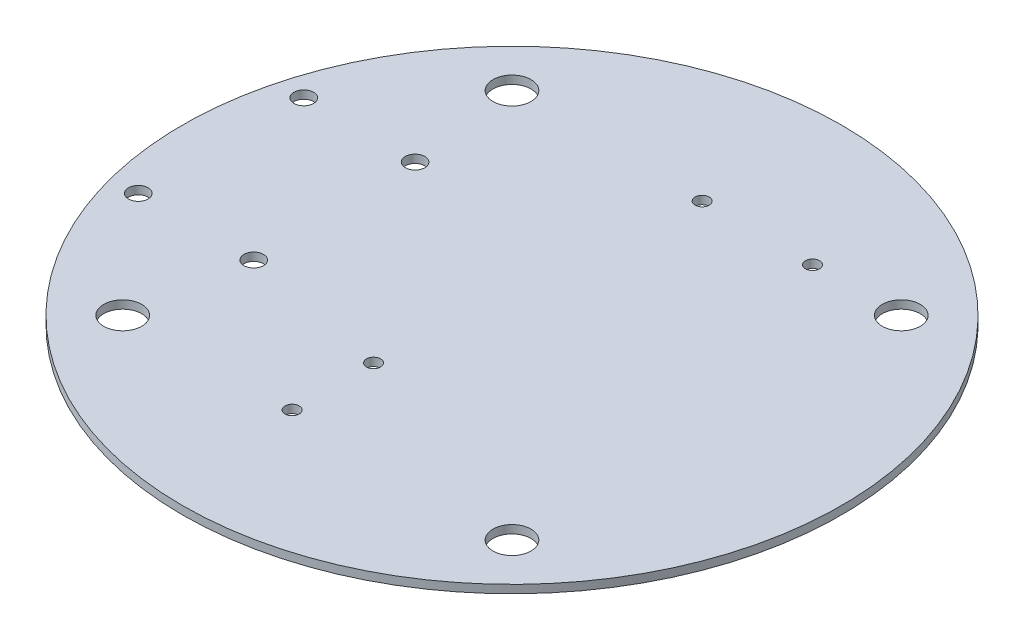
ISO-10303-21;
HEADER;
FILE_DESCRIPTION(('STEP AP214'),'2;1');
FILE_NAME('part.step','',(''),(''),'','','');
FILE_SCHEMA(('AUTOMOTIVE_DESIGN { 1 0 10303 214 1 1 1 1 }'));
ENDSEC;
DATA;
#1=APPLICATION_CONTEXT('core data for automotive mechanical design processes');
#2=APPLICATION_PROTOCOL_DEFINITION('international standard','automotive_design',2000,#1);
#3=PRODUCT_CONTEXT('',#1,'mechanical');
#4=PRODUCT('Part','Part','',(#3));
#5=PRODUCT_RELATED_PRODUCT_CATEGORY('part','',(#4));
#6=PRODUCT_DEFINITION_FORMATION('','',#4);
#7=PRODUCT_DEFINITION_CONTEXT('part definition',#1,'design');
#8=PRODUCT_DEFINITION('design','',#6,#7);
#9=PRODUCT_DEFINITION_SHAPE('','',#8);
#10=(LENGTH_UNIT() NAMED_UNIT(*) SI_UNIT(.MILLI.,.METRE.));
#11=(NAMED_UNIT(*) PLANE_ANGLE_UNIT() SI_UNIT($,.RADIAN.));
#12=(NAMED_UNIT(*) SI_UNIT($,.STERADIAN.) SOLID_ANGLE_UNIT());
#13=UNCERTAINTY_MEASURE_WITH_UNIT(LENGTH_MEASURE(1.E-05),#10,'distance_accuracy_value','');
#14=(GEOMETRIC_REPRESENTATION_CONTEXT(3) GLOBAL_UNCERTAINTY_ASSIGNED_CONTEXT((#13)) GLOBAL_UNIT_ASSIGNED_CONTEXT((#10,
#11,#12)) REPRESENTATION_CONTEXT('',''));
#15=CARTESIAN_POINT('',(0.,0.,0.));
#16=DIRECTION('',(0.,0.,1.));
#17=DIRECTION('',(1.,0.,0.));
#18=AXIS2_PLACEMENT_3D('',#15,#16,#17);
#19=CARTESIAN_POINT('',(0.,1.5,0.));
#20=DIRECTION('',(0.,-1.,0.));
#21=DIRECTION('',(0.,0.,-1.));
#22=AXIS2_PLACEMENT_3D('',#19,#20,#21);
#23=CYLINDRICAL_SURFACE('',#22,60.7);
#24=CARTESIAN_POINT('',(0.,1.5,0.));
#25=DIRECTION('',(0.,1.,0.));
#26=DIRECTION('',(0.,0.,1.));
#27=AXIS2_PLACEMENT_3D('',#24,#25,#26);
#28=CIRCLE('',#27,60.7);
#29=CARTESIAN_POINT('',(0.,1.5,60.7));
#30=VERTEX_POINT('',#29);
#31=EDGE_CURVE('E10',#30,#30,#28,.T.);
#32=ORIENTED_EDGE('',*,*,#31,.F.);
#33=EDGE_LOOP('',(#32));
#34=FACE_BOUND('',#33,.T.);
#35=CARTESIAN_POINT('',(0.,0.,0.));
#36=DIRECTION('',(0.,1.,0.));
#37=DIRECTION('',(0.,0.,1.));
#38=AXIS2_PLACEMENT_3D('',#35,#36,#37);
#39=CIRCLE('',#38,60.7);
#40=CARTESIAN_POINT('',(0.,0.,60.7));
#41=VERTEX_POINT('',#40);
#42=EDGE_CURVE('E40',#41,#41,#39,.T.);
#43=ORIENTED_EDGE('',*,*,#42,.T.);
#44=EDGE_LOOP('',(#43));
#45=FACE_BOUND('',#44,.T.);
#46=ADVANCED_FACE('F37',(#34,#45),#23,.T.);
#47=CARTESIAN_POINT('',(0.,1.5,0.));
#48=DIRECTION('',(0.,1.,0.));
#49=DIRECTION('',(0.,0.,1.));
#50=AXIS2_PLACEMENT_3D('',#47,#48,#49);
#51=PLANE('',#50);
#52=CARTESIAN_POINT('',(-53.8645411901748,1.5,-15.5116906420591));
#53=DIRECTION('',(0.,1.,0.));
#54=DIRECTION('',(0.,0.,1.));
#55=AXIS2_PLACEMENT_3D('',#52,#53,#54);
#56=CIRCLE('',#55,1.8);
#57=CARTESIAN_POINT('',(-53.8645411901748,1.5,-13.7116906420591));
#58=VERTEX_POINT('',#57);
#59=EDGE_CURVE('E117',#58,#58,#56,.T.);
#60=ORIENTED_EDGE('',*,*,#59,.F.);
#61=EDGE_LOOP('',(#60));
#62=FACE_BOUND('',#61,.T.);
#63=CARTESIAN_POINT('',(-53.8645465194656,1.5,14.9683093579404));
#64=DIRECTION('',(0.,1.,0.));
#65=DIRECTION('',(0.,0.,1.));
#66=AXIS2_PLACEMENT_3D('',#63,#64,#65);
#67=CIRCLE('',#66,1.8);
#68=CARTESIAN_POINT('',(-53.8645465194656,1.5,16.7683093579404));
#69=VERTEX_POINT('',#68);
#70=EDGE_CURVE('E111',#69,#69,#67,.T.);
#71=ORIENTED_EDGE('',*,*,#70,.F.);
#72=EDGE_LOOP('',(#71));
#73=FACE_BOUND('',#72,.T.);
#74=CARTESIAN_POINT('',(-32.6045465194659,1.5,14.9683130751557));
#75=DIRECTION('',(0.,1.,0.));
#76=DIRECTION('',(0.,0.,1.));
#77=AXIS2_PLACEMENT_3D('',#74,#75,#76);
#78=CIRCLE('',#77,1.8);
#79=CARTESIAN_POINT('',(-32.6045465194659,1.5,16.7683130751557));
#80=VERTEX_POINT('',#79);
#81=EDGE_CURVE('E105',#80,#80,#78,.T.);
#82=ORIENTED_EDGE('',*,*,#81,.F.);
#83=EDGE_LOOP('',(#82));
#84=FACE_BOUND('',#83,.T.);
#85=CARTESIAN_POINT('',(-33.3665411901751,1.5,-15.5116870580761));
#86=DIRECTION('',(0.,1.,0.));
#87=DIRECTION('',(0.,0.,1.));
#88=AXIS2_PLACEMENT_3D('',#85,#86,#87);
#89=CIRCLE('',#88,1.8);
#90=CARTESIAN_POINT('',(-33.3665411901751,1.5,-13.7116870580761));
#91=VERTEX_POINT('',#90);
#92=EDGE_CURVE('E99',#91,#91,#89,.T.);
#93=ORIENTED_EDGE('',*,*,#92,.F.);
#94=EDGE_LOOP('',(#93));
#95=FACE_BOUND('',#94,.T.);
#96=CARTESIAN_POINT('',(-0.709999951317196,1.5,-35.7300001112108));
#97=DIRECTION('',(0.,1.,0.));
#98=DIRECTION('',(0.,0.,1.));
#99=AXIS2_PLACEMENT_3D('',#96,#97,#98);
#100=CIRCLE('',#99,1.3);
#101=CARTESIAN_POINT('',(-0.709999951317196,1.5,-34.4300001112108));
#102=VERTEX_POINT('',#101);
#103=EDGE_CURVE('E93',#102,#102,#100,.T.);
#104=ORIENTED_EDGE('',*,*,#103,.F.);
#105=EDGE_LOOP('',(#104));
#106=FACE_BOUND('',#105,.T.);
#107=CARTESIAN_POINT('',(19.6100001279254,1.5,-35.7300001358775));
#108=DIRECTION('',(0.,1.,0.));
#109=DIRECTION('',(0.,0.,1.));
#110=AXIS2_PLACEMENT_3D('',#107,#108,#109);
#111=CIRCLE('',#110,1.3);
#112=CARTESIAN_POINT('',(19.6100001279254,1.5,-34.4300001358775));
#113=VERTEX_POINT('',#112);
#114=EDGE_CURVE('E87',#113,#113,#111,.T.);
#115=ORIENTED_EDGE('',*,*,#114,.F.);
#116=EDGE_LOOP('',(#115));
#117=FACE_BOUND('',#116,.T.);
#118=CARTESIAN_POINT('',(-5.154,1.5,20.3503138061578));
#119=DIRECTION('',(0.,1.,0.));
#120=DIRECTION('',(0.,0.,1.));
#121=AXIS2_PLACEMENT_3D('',#118,#119,#120);
#122=CIRCLE('',#121,1.3);
#123=CARTESIAN_POINT('',(-5.154,1.5,21.6503138061578));
#124=VERTEX_POINT('',#123);
#125=EDGE_CURVE('E81',#124,#124,#122,.T.);
#126=ORIENTED_EDGE('',*,*,#125,.F.);
#127=EDGE_LOOP('',(#126));
#128=FACE_BOUND('',#127,.T.);
#129=CARTESIAN_POINT('',(-5.15399999999999,1.5,35.3503138061578));
#130=DIRECTION('',(0.,1.,0.));
#131=DIRECTION('',(0.,0.,1.));
#132=AXIS2_PLACEMENT_3D('',#129,#130,#131);
#133=CIRCLE('',#132,1.3);
#134=CARTESIAN_POINT('',(-5.15399999999999,1.5,36.6503138061578));
#135=VERTEX_POINT('',#134);
#136=EDGE_CURVE('E75',#135,#135,#133,.T.);
#137=ORIENTED_EDGE('',*,*,#136,.F.);
#138=EDGE_LOOP('',(#137));
#139=FACE_BOUND('',#138,.T.);
#140=CARTESIAN_POINT('',(35.8503138061574,1.5,35.8503138061585));
#141=DIRECTION('',(0.,1.,0.));
#142=DIRECTION('',(0.,0.,1.));
#143=AXIS2_PLACEMENT_3D('',#140,#141,#142);
#144=CIRCLE('',#143,3.49999999999999);
#145=CARTESIAN_POINT('',(35.8503138061574,1.5,39.3503138061585));
#146=VERTEX_POINT('',#145);
#147=EDGE_CURVE('E69',#146,#146,#144,.T.);
#148=ORIENTED_EDGE('',*,*,#147,.F.);
#149=EDGE_LOOP('',(#148));
#150=FACE_BOUND('',#149,.T.);
#151=CARTESIAN_POINT('',(35.8503138061581,1.5,-35.8503138061578));
#152=DIRECTION('',(0.,1.,0.));
#153=DIRECTION('',(0.,0.,1.));
#154=AXIS2_PLACEMENT_3D('',#151,#152,#153);
#155=CIRCLE('',#154,3.49999999999999);
#156=CARTESIAN_POINT('',(35.8503138061581,1.5,-32.3503138061578));
#157=VERTEX_POINT('',#156);
#158=EDGE_CURVE('E63',#157,#157,#155,.T.);
#159=ORIENTED_EDGE('',*,*,#158,.F.);
#160=EDGE_LOOP('',(#159));
#161=FACE_BOUND('',#160,.T.);
#162=CARTESIAN_POINT('',(-35.8503138061577,1.5,-35.8503138061583));
#163=DIRECTION('',(0.,1.,0.));
#164=DIRECTION('',(0.,0.,1.));
#165=AXIS2_PLACEMENT_3D('',#162,#163,#164);
#166=CIRCLE('',#165,3.49999999999999);
#167=CARTESIAN_POINT('',(-35.8503138061577,1.5,-32.3503138061583));
#168=VERTEX_POINT('',#167);
#169=EDGE_CURVE('E57',#168,#168,#166,.T.);
#170=ORIENTED_EDGE('',*,*,#169,.F.);
#171=EDGE_LOOP('',(#170));
#172=FACE_BOUND('',#171,.T.);
#173=CARTESIAN_POINT('',(-35.8503138061581,1.5,35.8503138061578));
#174=DIRECTION('',(0.,1.,0.));
#175=DIRECTION('',(0.,0.,1.));
#176=AXIS2_PLACEMENT_3D('',#173,#174,#175);
#177=CIRCLE('',#176,3.49999999999999);
#178=CARTESIAN_POINT('',(-35.8503138061581,1.5,39.3503138061578));
#179=VERTEX_POINT('',#178);
#180=EDGE_CURVE('E51',#179,#179,#177,.T.);
#181=ORIENTED_EDGE('',*,*,#180,.F.);
#182=EDGE_LOOP('',(#181));
#183=FACE_BOUND('',#182,.T.);
#184=ORIENTED_EDGE('',*,*,#31,.T.);
#185=EDGE_LOOP('',(#184));
#186=FACE_BOUND('',#185,.T.);
#187=ADVANCED_FACE('F123',(#62,#73,#84,#95,#106,#117,#128,#139,#150,#161,#172,#183,#186),#51,.T.);
#188=CARTESIAN_POINT('',(0.,0.,0.));
#189=DIRECTION('',(0.,1.,0.));
#190=DIRECTION('',(0.,0.,1.));
#191=AXIS2_PLACEMENT_3D('',#188,#189,#190);
#192=PLANE('',#191);
#193=CARTESIAN_POINT('',(-53.8645411901748,0.,-15.5116906420591));
#194=DIRECTION('',(0.,1.,0.));
#195=DIRECTION('',(0.,0.,1.));
#196=AXIS2_PLACEMENT_3D('',#193,#194,#195);
#197=CIRCLE('',#196,1.8);
#198=CARTESIAN_POINT('',(-53.8645411901748,0.,-13.7116906420591));
#199=VERTEX_POINT('',#198);
#200=EDGE_CURVE('E114',#199,#199,#197,.T.);
#201=ORIENTED_EDGE('',*,*,#200,.T.);
#202=EDGE_LOOP('',(#201));
#203=FACE_BOUND('',#202,.T.);
#204=CARTESIAN_POINT('',(-53.8645465194656,0.,14.9683093579404));
#205=DIRECTION('',(0.,1.,0.));
#206=DIRECTION('',(0.,0.,1.));
#207=AXIS2_PLACEMENT_3D('',#204,#205,#206);
#208=CIRCLE('',#207,1.8);
#209=CARTESIAN_POINT('',(-53.8645465194656,0.,16.7683093579404));
#210=VERTEX_POINT('',#209);
#211=EDGE_CURVE('E108',#210,#210,#208,.T.);
#212=ORIENTED_EDGE('',*,*,#211,.T.);
#213=EDGE_LOOP('',(#212));
#214=FACE_BOUND('',#213,.T.);
#215=CARTESIAN_POINT('',(-32.6045465194659,0.,14.9683130751557));
#216=DIRECTION('',(0.,1.,0.));
#217=DIRECTION('',(0.,0.,1.));
#218=AXIS2_PLACEMENT_3D('',#215,#216,#217);
#219=CIRCLE('',#218,1.8);
#220=CARTESIAN_POINT('',(-32.6045465194659,0.,16.7683130751557));
#221=VERTEX_POINT('',#220);
#222=EDGE_CURVE('E102',#221,#221,#219,.T.);
#223=ORIENTED_EDGE('',*,*,#222,.T.);
#224=EDGE_LOOP('',(#223));
#225=FACE_BOUND('',#224,.T.);
#226=CARTESIAN_POINT('',(-33.3665411901751,0.,-15.5116870580761));
#227=DIRECTION('',(0.,1.,0.));
#228=DIRECTION('',(0.,0.,1.));
#229=AXIS2_PLACEMENT_3D('',#226,#227,#228);
#230=CIRCLE('',#229,1.8);
#231=CARTESIAN_POINT('',(-33.3665411901751,0.,-13.7116870580761));
#232=VERTEX_POINT('',#231);
#233=EDGE_CURVE('E96',#232,#232,#230,.T.);
#234=ORIENTED_EDGE('',*,*,#233,.T.);
#235=EDGE_LOOP('',(#234));
#236=FACE_BOUND('',#235,.T.);
#237=CARTESIAN_POINT('',(-0.709999951317196,0.,-35.7300001112108));
#238=DIRECTION('',(0.,1.,0.));
#239=DIRECTION('',(0.,0.,1.));
#240=AXIS2_PLACEMENT_3D('',#237,#238,#239);
#241=CIRCLE('',#240,1.3);
#242=CARTESIAN_POINT('',(-0.709999951317196,0.,-34.4300001112108));
#243=VERTEX_POINT('',#242);
#244=EDGE_CURVE('E90',#243,#243,#241,.T.);
#245=ORIENTED_EDGE('',*,*,#244,.T.);
#246=EDGE_LOOP('',(#245));
#247=FACE_BOUND('',#246,.T.);
#248=CARTESIAN_POINT('',(19.6100001279254,0.,-35.7300001358775));
#249=DIRECTION('',(0.,1.,0.));
#250=DIRECTION('',(0.,0.,1.));
#251=AXIS2_PLACEMENT_3D('',#248,#249,#250);
#252=CIRCLE('',#251,1.3);
#253=CARTESIAN_POINT('',(19.6100001279254,0.,-34.4300001358775));
#254=VERTEX_POINT('',#253);
#255=EDGE_CURVE('E84',#254,#254,#252,.T.);
#256=ORIENTED_EDGE('',*,*,#255,.T.);
#257=EDGE_LOOP('',(#256));
#258=FACE_BOUND('',#257,.T.);
#259=CARTESIAN_POINT('',(-5.154,0.,20.3503138061578));
#260=DIRECTION('',(0.,1.,0.));
#261=DIRECTION('',(0.,0.,1.));
#262=AXIS2_PLACEMENT_3D('',#259,#260,#261);
#263=CIRCLE('',#262,1.3);
#264=CARTESIAN_POINT('',(-5.154,0.,21.6503138061578));
#265=VERTEX_POINT('',#264);
#266=EDGE_CURVE('E78',#265,#265,#263,.T.);
#267=ORIENTED_EDGE('',*,*,#266,.T.);
#268=EDGE_LOOP('',(#267));
#269=FACE_BOUND('',#268,.T.);
#270=CARTESIAN_POINT('',(-5.15399999999999,0.,35.3503138061578));
#271=DIRECTION('',(0.,1.,0.));
#272=DIRECTION('',(0.,0.,1.));
#273=AXIS2_PLACEMENT_3D('',#270,#271,#272);
#274=CIRCLE('',#273,1.3);
#275=CARTESIAN_POINT('',(-5.15399999999999,0.,36.6503138061578));
#276=VERTEX_POINT('',#275);
#277=EDGE_CURVE('E72',#276,#276,#274,.T.);
#278=ORIENTED_EDGE('',*,*,#277,.T.);
#279=EDGE_LOOP('',(#278));
#280=FACE_BOUND('',#279,.T.);
#281=CARTESIAN_POINT('',(35.8503138061574,0.,35.8503138061585));
#282=DIRECTION('',(0.,1.,0.));
#283=DIRECTION('',(0.,0.,1.));
#284=AXIS2_PLACEMENT_3D('',#281,#282,#283);
#285=CIRCLE('',#284,3.5);
#286=CARTESIAN_POINT('',(35.8503138061574,0.,39.3503138061585));
#287=VERTEX_POINT('',#286);
#288=EDGE_CURVE('E66',#287,#287,#285,.T.);
#289=ORIENTED_EDGE('',*,*,#288,.T.);
#290=EDGE_LOOP('',(#289));
#291=FACE_BOUND('',#290,.T.);
#292=CARTESIAN_POINT('',(35.8503138061581,0.,-35.8503138061578));
#293=DIRECTION('',(0.,1.,0.));
#294=DIRECTION('',(0.,0.,1.));
#295=AXIS2_PLACEMENT_3D('',#292,#293,#294);
#296=CIRCLE('',#295,3.5);
#297=CARTESIAN_POINT('',(35.8503138061581,0.,-32.3503138061578));
#298=VERTEX_POINT('',#297);
#299=EDGE_CURVE('E60',#298,#298,#296,.T.);
#300=ORIENTED_EDGE('',*,*,#299,.T.);
#301=EDGE_LOOP('',(#300));
#302=FACE_BOUND('',#301,.T.);
#303=CARTESIAN_POINT('',(-35.8503138061577,0.,-35.8503138061583));
#304=DIRECTION('',(0.,1.,0.));
#305=DIRECTION('',(0.,0.,1.));
#306=AXIS2_PLACEMENT_3D('',#303,#304,#305);
#307=CIRCLE('',#306,3.5);
#308=CARTESIAN_POINT('',(-35.8503138061577,0.,-32.3503138061583));
#309=VERTEX_POINT('',#308);
#310=EDGE_CURVE('E54',#309,#309,#307,.T.);
#311=ORIENTED_EDGE('',*,*,#310,.T.);
#312=EDGE_LOOP('',(#311));
#313=FACE_BOUND('',#312,.T.);
#314=CARTESIAN_POINT('',(-35.8503138061581,0.,35.8503138061578));
#315=DIRECTION('',(0.,1.,0.));
#316=DIRECTION('',(0.,0.,1.));
#317=AXIS2_PLACEMENT_3D('',#314,#315,#316);
#318=CIRCLE('',#317,3.5);
#319=CARTESIAN_POINT('',(-35.8503138061581,0.,39.3503138061578));
#320=VERTEX_POINT('',#319);
#321=EDGE_CURVE('E47',#320,#320,#318,.T.);
#322=ORIENTED_EDGE('',*,*,#321,.T.);
#323=EDGE_LOOP('',(#322));
#324=FACE_BOUND('',#323,.T.);
#325=ORIENTED_EDGE('',*,*,#42,.F.);
#326=EDGE_LOOP('',(#325));
#327=FACE_BOUND('',#326,.T.);
#328=ADVANCED_FACE('F126',(#203,#214,#225,#236,#247,#258,#269,#280,#291,#302,#313,#324,#327),
#192,.F.);
#329=CARTESIAN_POINT('',(-35.8503138061581,1.5,35.8503138061578));
#330=DIRECTION('',(0.,1.,0.));
#331=DIRECTION('',(0.,0.,1.));
#332=AXIS2_PLACEMENT_3D('',#329,#330,#331);
#333=CYLINDRICAL_SURFACE('',#332,3.5);
#334=ORIENTED_EDGE('',*,*,#321,.F.);
#335=EDGE_LOOP('',(#334));
#336=FACE_BOUND('',#335,.T.);
#337=ORIENTED_EDGE('',*,*,#180,.T.);
#338=EDGE_LOOP('',(#337));
#339=FACE_BOUND('',#338,.T.);
#340=ADVANCED_FACE('F150',(#336,#339),#333,.F.);
#341=CARTESIAN_POINT('',(-35.8503138061577,1.5,-35.8503138061583));
#342=DIRECTION('',(0.,1.,0.));
#343=DIRECTION('',(0.,0.,1.));
#344=AXIS2_PLACEMENT_3D('',#341,#342,#343);
#345=CYLINDRICAL_SURFACE('',#344,3.5);
#346=ORIENTED_EDGE('',*,*,#310,.F.);
#347=EDGE_LOOP('',(#346));
#348=FACE_BOUND('',#347,.T.);
#349=ORIENTED_EDGE('',*,*,#169,.T.);
#350=EDGE_LOOP('',(#349));
#351=FACE_BOUND('',#350,.T.);
#352=ADVANCED_FACE('F152',(#348,#351),#345,.F.);
#353=CARTESIAN_POINT('',(35.8503138061581,1.5,-35.8503138061578));
#354=DIRECTION('',(0.,1.,0.));
#355=DIRECTION('',(0.,0.,1.));
#356=AXIS2_PLACEMENT_3D('',#353,#354,#355);
#357=CYLINDRICAL_SURFACE('',#356,3.5);
#358=ORIENTED_EDGE('',*,*,#299,.F.);
#359=EDGE_LOOP('',(#358));
#360=FACE_BOUND('',#359,.T.);
#361=ORIENTED_EDGE('',*,*,#158,.T.);
#362=EDGE_LOOP('',(#361));
#363=FACE_BOUND('',#362,.T.);
#364=ADVANCED_FACE('F159',(#360,#363),#357,.F.);
#365=CARTESIAN_POINT('',(35.8503138061574,1.5,35.8503138061585));
#366=DIRECTION('',(0.,1.,0.));
#367=DIRECTION('',(0.,0.,1.));
#368=AXIS2_PLACEMENT_3D('',#365,#366,#367);
#369=CYLINDRICAL_SURFACE('',#368,3.5);
#370=ORIENTED_EDGE('',*,*,#288,.F.);
#371=EDGE_LOOP('',(#370));
#372=FACE_BOUND('',#371,.T.);
#373=ORIENTED_EDGE('',*,*,#147,.T.);
#374=EDGE_LOOP('',(#373));
#375=FACE_BOUND('',#374,.T.);
#376=ADVANCED_FACE('F268',(#372,#375),#369,.F.);
#377=CARTESIAN_POINT('',(-5.15399999999999,1.5,35.3503138061578));
#378=DIRECTION('',(0.,1.,0.));
#379=DIRECTION('',(0.,0.,1.));
#380=AXIS2_PLACEMENT_3D('',#377,#378,#379);
#381=CYLINDRICAL_SURFACE('',#380,1.3);
#382=ORIENTED_EDGE('',*,*,#277,.F.);
#383=EDGE_LOOP('',(#382));
#384=FACE_BOUND('',#383,.T.);
#385=ORIENTED_EDGE('',*,*,#136,.T.);
#386=EDGE_LOOP('',(#385));
#387=FACE_BOUND('',#386,.T.);
#388=ADVANCED_FACE('F258',(#384,#387),#381,.F.);
#389=CARTESIAN_POINT('',(-5.154,1.5,20.3503138061578));
#390=DIRECTION('',(0.,1.,0.));
#391=DIRECTION('',(0.,0.,1.));
#392=AXIS2_PLACEMENT_3D('',#389,#390,#391);
#393=CYLINDRICAL_SURFACE('',#392,1.3);
#394=ORIENTED_EDGE('',*,*,#266,.F.);
#395=EDGE_LOOP('',(#394));
#396=FACE_BOUND('',#395,.T.);
#397=ORIENTED_EDGE('',*,*,#125,.T.);
#398=EDGE_LOOP('',(#397));
#399=FACE_BOUND('',#398,.T.);
#400=ADVANCED_FACE('F248',(#396,#399),#393,.F.);
#401=CARTESIAN_POINT('',(19.6100001279254,1.5,-35.7300001358775));
#402=DIRECTION('',(0.,1.,0.));
#403=DIRECTION('',(0.,0.,1.));
#404=AXIS2_PLACEMENT_3D('',#401,#402,#403);
#405=CYLINDRICAL_SURFACE('',#404,1.3);
#406=ORIENTED_EDGE('',*,*,#255,.F.);
#407=EDGE_LOOP('',(#406));
#408=FACE_BOUND('',#407,.T.);
#409=ORIENTED_EDGE('',*,*,#114,.T.);
#410=EDGE_LOOP('',(#409));
#411=FACE_BOUND('',#410,.T.);
#412=ADVANCED_FACE('F239',(#408,#411),#405,.F.);
#413=CARTESIAN_POINT('',(-0.709999951317196,1.5,-35.7300001112108));
#414=DIRECTION('',(0.,1.,0.));
#415=DIRECTION('',(0.,0.,1.));
#416=AXIS2_PLACEMENT_3D('',#413,#414,#415);
#417=CYLINDRICAL_SURFACE('',#416,1.3);
#418=ORIENTED_EDGE('',*,*,#244,.F.);
#419=EDGE_LOOP('',(#418));
#420=FACE_BOUND('',#419,.T.);
#421=ORIENTED_EDGE('',*,*,#103,.T.);
#422=EDGE_LOOP('',(#421));
#423=FACE_BOUND('',#422,.T.);
#424=ADVANCED_FACE('F193',(#420,#423),#417,.F.);
#425=CARTESIAN_POINT('',(-33.3665411901751,1.5,-15.5116870580761));
#426=DIRECTION('',(0.,1.,0.));
#427=DIRECTION('',(0.,0.,1.));
#428=AXIS2_PLACEMENT_3D('',#425,#426,#427);
#429=CYLINDRICAL_SURFACE('',#428,1.8);
#430=ORIENTED_EDGE('',*,*,#233,.F.);
#431=EDGE_LOOP('',(#430));
#432=FACE_BOUND('',#431,.T.);
#433=ORIENTED_EDGE('',*,*,#92,.T.);
#434=EDGE_LOOP('',(#433));
#435=FACE_BOUND('',#434,.T.);
#436=ADVANCED_FACE('F187',(#432,#435),#429,.F.);
#437=CARTESIAN_POINT('',(-32.6045465194659,1.5,14.9683130751557));
#438=DIRECTION('',(0.,1.,0.));
#439=DIRECTION('',(0.,0.,1.));
#440=AXIS2_PLACEMENT_3D('',#437,#438,#439);
#441=CYLINDRICAL_SURFACE('',#440,1.8);
#442=ORIENTED_EDGE('',*,*,#222,.F.);
#443=EDGE_LOOP('',(#442));
#444=FACE_BOUND('',#443,.T.);
#445=ORIENTED_EDGE('',*,*,#81,.T.);
#446=EDGE_LOOP('',(#445));
#447=FACE_BOUND('',#446,.T.);
#448=ADVANCED_FACE('F192',(#444,#447),#441,.F.);
#449=CARTESIAN_POINT('',(-53.8645465194656,1.5,14.9683093579404));
#450=DIRECTION('',(0.,1.,0.));
#451=DIRECTION('',(0.,0.,1.));
#452=AXIS2_PLACEMENT_3D('',#449,#450,#451);
#453=CYLINDRICAL_SURFACE('',#452,1.8);
#454=ORIENTED_EDGE('',*,*,#211,.F.);
#455=EDGE_LOOP('',(#454));
#456=FACE_BOUND('',#455,.T.);
#457=ORIENTED_EDGE('',*,*,#70,.T.);
#458=EDGE_LOOP('',(#457));
#459=FACE_BOUND('',#458,.T.);
#460=ADVANCED_FACE('F206',(#456,#459),#453,.F.);
#461=CARTESIAN_POINT('',(-53.8645411901748,1.5,-15.5116906420591));
#462=DIRECTION('',(0.,1.,0.));
#463=DIRECTION('',(0.,0.,1.));
#464=AXIS2_PLACEMENT_3D('',#461,#462,#463);
#465=CYLINDRICAL_SURFACE('',#464,1.8);
#466=ORIENTED_EDGE('',*,*,#200,.F.);
#467=EDGE_LOOP('',(#466));
#468=FACE_BOUND('',#467,.T.);
#469=ORIENTED_EDGE('',*,*,#59,.T.);
#470=EDGE_LOOP('',(#469));
#471=FACE_BOUND('',#470,.T.);
#472=ADVANCED_FACE('F121',(#468,#471),#465,.F.);
#473=CLOSED_SHELL('',(#46,#187,#328,#340,#352,#364,#376,#388,#400,#412,#424,#436,#448,#460,#472));
#474=MANIFOLD_SOLID_BREP('B2',#473);
#475=ADVANCED_BREP_SHAPE_REPRESENTATION('',(#18,#474),#14);
#476=SHAPE_DEFINITION_REPRESENTATION(#9,#475);
ENDSEC;
END-ISO-10303-21;
